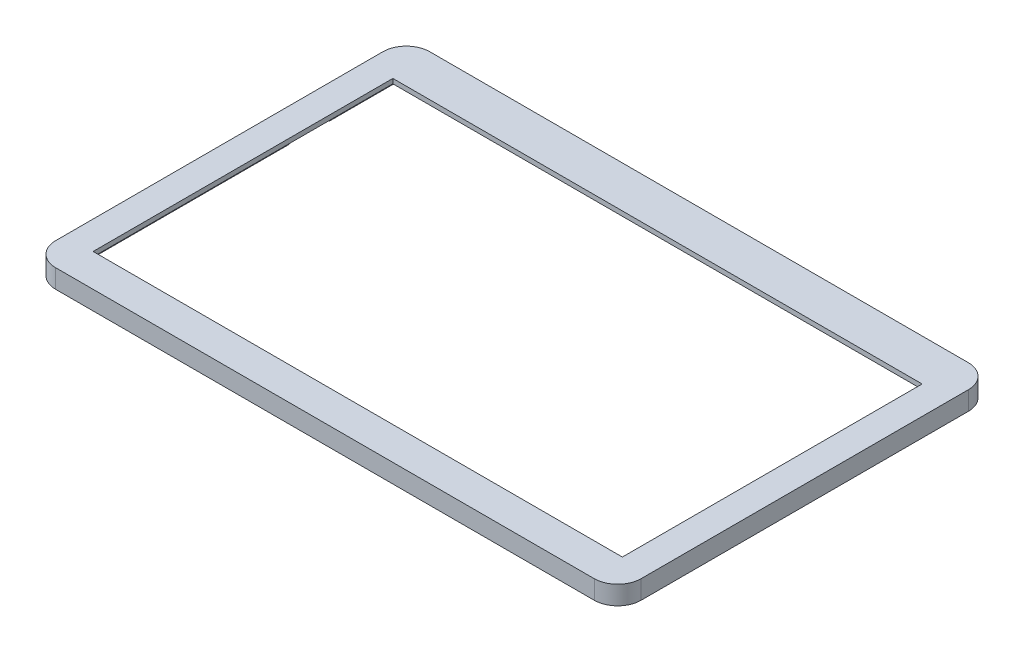
ISO-10303-21;
HEADER;
FILE_DESCRIPTION(('STEP AP214'),'2;1');
FILE_NAME('part.step','',(''),(''),'','','');
FILE_SCHEMA(('AUTOMOTIVE_DESIGN { 1 0 10303 214 1 1 1 1 }'));
ENDSEC;
DATA;
#1=APPLICATION_CONTEXT('core data for automotive mechanical design processes');
#2=APPLICATION_PROTOCOL_DEFINITION('international standard','automotive_design',2000,#1);
#3=PRODUCT_CONTEXT('',#1,'mechanical');
#4=PRODUCT('Part','Part','',(#3));
#5=PRODUCT_RELATED_PRODUCT_CATEGORY('part','',(#4));
#6=PRODUCT_DEFINITION_FORMATION('','',#4);
#7=PRODUCT_DEFINITION_CONTEXT('part definition',#1,'design');
#8=PRODUCT_DEFINITION('design','',#6,#7);
#9=PRODUCT_DEFINITION_SHAPE('','',#8);
#10=(LENGTH_UNIT() NAMED_UNIT(*) SI_UNIT(.MILLI.,.METRE.));
#11=(NAMED_UNIT(*) PLANE_ANGLE_UNIT() SI_UNIT($,.RADIAN.));
#12=(NAMED_UNIT(*) SI_UNIT($,.STERADIAN.) SOLID_ANGLE_UNIT());
#13=UNCERTAINTY_MEASURE_WITH_UNIT(LENGTH_MEASURE(1.E-05),#10,'distance_accuracy_value','');
#14=(GEOMETRIC_REPRESENTATION_CONTEXT(3) GLOBAL_UNCERTAINTY_ASSIGNED_CONTEXT((#13)) GLOBAL_UNIT_ASSIGNED_CONTEXT((#10,
#11,#12)) REPRESENTATION_CONTEXT('',''));
#15=CARTESIAN_POINT('',(0.,0.,0.));
#16=DIRECTION('',(0.,0.,1.));
#17=DIRECTION('',(1.,0.,0.));
#18=AXIS2_PLACEMENT_3D('',#15,#16,#17);
#19=CARTESIAN_POINT('',(0.,8.,0.));
#20=DIRECTION('',(0.,1.,0.));
#21=DIRECTION('',(0.,0.,1.));
#22=AXIS2_PLACEMENT_3D('',#19,#20,#21);
#23=PLANE('',#22);
#24=DIRECTION('',(1.,0.,0.));
#25=VECTOR('',#24,1.);
#26=CARTESIAN_POINT('',(-87.3406720741599,8.,78.8980301274625));
#27=LINE('',#26,#25);
#28=CARTESIAN_POINT('',(-87.3406720741599,8.,78.8980301274625));
#29=VERTEX_POINT('',#28);
#30=CARTESIAN_POINT('',(138.65932792584,8.,78.8980301274625));
#31=VERTEX_POINT('',#30);
#32=EDGE_CURVE('E392',#29,#31,#27,.T.);
#33=ORIENTED_EDGE('',*,*,#32,.F.);
#34=DIRECTION('',(0.,0.,1.));
#35=VECTOR('',#34,1.);
#36=CARTESIAN_POINT('',(-87.3406720741599,8.,-49.1019698725375));
#37=LINE('',#36,#35);
#38=CARTESIAN_POINT('',(-87.3406720741599,8.,-49.1019698725375));
#39=VERTEX_POINT('',#38);
#40=EDGE_CURVE('E389',#39,#29,#37,.T.);
#41=ORIENTED_EDGE('',*,*,#40,.F.);
#42=DIRECTION('',(-1.,0.,0.));
#43=VECTOR('',#42,1.);
#44=CARTESIAN_POINT('',(-87.3406720741599,8.,-49.1019698725375));
#45=LINE('',#44,#43);
#46=CARTESIAN_POINT('',(138.65932792584,8.,-49.1019698725375));
#47=VERTEX_POINT('',#46);
#48=EDGE_CURVE('E399',#47,#39,#45,.T.);
#49=ORIENTED_EDGE('',*,*,#48,.F.);
#50=DIRECTION('',(0.,0.,-1.));
#51=VECTOR('',#50,1.);
#52=CARTESIAN_POINT('',(138.65932792584,8.,-49.1019698725375));
#53=LINE('',#52,#51);
#54=EDGE_CURVE('E395',#31,#47,#53,.T.);
#55=ORIENTED_EDGE('',*,*,#54,.F.);
#56=EDGE_LOOP('',(#33,#41,#49,#55));
#57=FACE_BOUND('',#56,.T.);
#58=CARTESIAN_POINT('',(140.65932792584,8.,82.8980301274625));
#59=DIRECTION('',(0.,1.,0.));
#60=DIRECTION('',(0.,0.,1.));
#61=AXIS2_PLACEMENT_3D('',#58,#59,#60);
#62=CIRCLE('',#61,10.);
#63=CARTESIAN_POINT('',(150.65932792584,8.,82.8980301274624));
#64=VERTEX_POINT('',#63);
#65=CARTESIAN_POINT('',(140.65932792584,8.,92.8980301274625));
#66=VERTEX_POINT('',#65);
#67=EDGE_CURVE('E319',#64,#66,#62,.F.);
#68=ORIENTED_EDGE('',*,*,#67,.F.);
#69=DIRECTION('',(0.,0.,-1.));
#70=VECTOR('',#69,1.);
#71=CARTESIAN_POINT('',(150.65932792584,8.,-63.1019698725375));
#72=LINE('',#71,#70);
#73=CARTESIAN_POINT('',(150.65932792584,8.,-56.8519698725374));
#74=VERTEX_POINT('',#73);
#75=EDGE_CURVE('E428',#64,#74,#72,.T.);
#76=ORIENTED_EDGE('',*,*,#75,.T.);
#77=CARTESIAN_POINT('',(140.65932792584,8.,-56.8519698725375));
#78=DIRECTION('',(0.,1.,0.));
#79=DIRECTION('',(0.,0.,1.));
#80=AXIS2_PLACEMENT_3D('',#77,#78,#79);
#81=CIRCLE('',#80,10.);
#82=CARTESIAN_POINT('',(140.65932792584,8.,-66.8519698725375));
#83=VERTEX_POINT('',#82);
#84=EDGE_CURVE('E316',#83,#74,#81,.F.);
#85=ORIENTED_EDGE('',*,*,#84,.F.);
#86=DIRECTION('',(1.,0.,0.));
#87=VECTOR('',#86,1.);
#88=CARTESIAN_POINT('',(150.65932792584,8.,-66.8519698725375));
#89=LINE('',#88,#87);
#90=CARTESIAN_POINT('',(-89.3406720741599,8.,-66.8519698725375));
#91=VERTEX_POINT('',#90);
#92=EDGE_CURVE('E329',#91,#83,#89,.T.);
#93=ORIENTED_EDGE('',*,*,#92,.F.);
#94=CARTESIAN_POINT('',(-89.3406720741599,8.,-56.8519698725375));
#95=DIRECTION('',(0.,1.,0.));
#96=DIRECTION('',(0.,0.,1.));
#97=AXIS2_PLACEMENT_3D('',#94,#95,#96);
#98=CIRCLE('',#97,9.99999999999999);
#99=CARTESIAN_POINT('',(-99.3406720741599,8.,-56.8519698725374));
#100=VERTEX_POINT('',#99);
#101=EDGE_CURVE('E313',#100,#91,#98,.F.);
#102=ORIENTED_EDGE('',*,*,#101,.F.);
#103=DIRECTION('',(0.,0.,1.));
#104=VECTOR('',#103,1.);
#105=CARTESIAN_POINT('',(-99.3406720741599,8.,-63.1019698725375));
#106=LINE('',#105,#104);
#107=CARTESIAN_POINT('',(-99.3406720741599,8.,82.8980301274624));
#108=VERTEX_POINT('',#107);
#109=EDGE_CURVE('E419',#100,#108,#106,.T.);
#110=ORIENTED_EDGE('',*,*,#109,.T.);
#111=CARTESIAN_POINT('',(-89.3406720741599,8.,82.8980301274625));
#112=DIRECTION('',(0.,1.,0.));
#113=DIRECTION('',(0.,0.,1.));
#114=AXIS2_PLACEMENT_3D('',#111,#112,#113);
#115=CIRCLE('',#114,9.99999999999999);
#116=CARTESIAN_POINT('',(-89.3406720741598,8.,92.8980301274625));
#117=VERTEX_POINT('',#116);
#118=EDGE_CURVE('E322',#117,#108,#115,.F.);
#119=ORIENTED_EDGE('',*,*,#118,.F.);
#120=DIRECTION('',(1.,0.,0.));
#121=VECTOR('',#120,1.);
#122=CARTESIAN_POINT('',(-99.3406720741599,8.,92.8980301274625));
#123=LINE('',#122,#121);
#124=EDGE_CURVE('E423',#117,#66,#123,.T.);
#125=ORIENTED_EDGE('',*,*,#124,.T.);
#126=EDGE_LOOP('',(#68,#76,#85,#93,#102,#110,#119,#125));
#127=FACE_BOUND('',#126,.T.);
#128=ADVANCED_FACE('F38',(#57,#127),#23,.T.);
#129=CARTESIAN_POINT('',(0.,0.,0.));
#130=DIRECTION('',(0.,1.,0.));
#131=DIRECTION('',(0.,0.,1.));
#132=AXIS2_PLACEMENT_3D('',#129,#130,#131);
#133=PLANE('',#132);
#134=CARTESIAN_POINT('',(-86.3406720741599,0.,-61.8519698725375));
#135=DIRECTION('',(0.,-1.,0.));
#136=DIRECTION('',(0.,0.,-1.));
#137=AXIS2_PLACEMENT_3D('',#134,#135,#136);
#138=CIRCLE('',#137,2.);
#139=CARTESIAN_POINT('',(-86.3406720741599,0.,-63.8519698725375));
#140=VERTEX_POINT('',#139);
#141=EDGE_CURVE('E253',#140,#140,#138,.T.);
#142=ORIENTED_EDGE('',*,*,#141,.F.);
#143=EDGE_LOOP('',(#142));
#144=FACE_BOUND('',#143,.T.);
#145=CARTESIAN_POINT('',(137.65932792584,0.,-61.8519698725375));
#146=DIRECTION('',(0.,-1.,0.));
#147=DIRECTION('',(0.,0.,-1.));
#148=AXIS2_PLACEMENT_3D('',#145,#146,#147);
#149=CIRCLE('',#148,2.);
#150=CARTESIAN_POINT('',(137.65932792584,0.,-63.8519698725375));
#151=VERTEX_POINT('',#150);
#152=EDGE_CURVE('E272',#151,#151,#149,.T.);
#153=ORIENTED_EDGE('',*,*,#152,.F.);
#154=EDGE_LOOP('',(#153));
#155=FACE_BOUND('',#154,.T.);
#156=CARTESIAN_POINT('',(137.65932792584,0.,87.8980301274625));
#157=DIRECTION('',(0.,-1.,0.));
#158=DIRECTION('',(0.,0.,-1.));
#159=AXIS2_PLACEMENT_3D('',#156,#157,#158);
#160=CIRCLE('',#159,2.);
#161=CARTESIAN_POINT('',(137.65932792584,0.,85.8980301274625));
#162=VERTEX_POINT('',#161);
#163=EDGE_CURVE('E264',#162,#162,#160,.T.);
#164=ORIENTED_EDGE('',*,*,#163,.F.);
#165=EDGE_LOOP('',(#164));
#166=FACE_BOUND('',#165,.T.);
#167=CARTESIAN_POINT('',(-86.3406720741599,0.,87.8980301274625));
#168=DIRECTION('',(0.,-1.,0.));
#169=DIRECTION('',(0.,0.,-1.));
#170=AXIS2_PLACEMENT_3D('',#167,#168,#169);
#171=CIRCLE('',#170,2.);
#172=CARTESIAN_POINT('',(-86.3406720741599,0.,85.8980301274625));
#173=VERTEX_POINT('',#172);
#174=EDGE_CURVE('E263',#173,#173,#171,.T.);
#175=ORIENTED_EDGE('',*,*,#174,.F.);
#176=EDGE_LOOP('',(#175));
#177=FACE_BOUND('',#176,.T.);
#178=DIRECTION('',(0.,0.,1.));
#179=VECTOR('',#178,1.);
#180=CARTESIAN_POINT('',(-99.3406720741599,0.,-63.1019698725375));
#181=LINE('',#180,#179);
#182=CARTESIAN_POINT('',(-99.3406720741599,0.,-10.5019698725375));
#183=VERTEX_POINT('',#182);
#184=CARTESIAN_POINT('',(-99.3406720741599,0.,82.8980301274624));
#185=VERTEX_POINT('',#184);
#186=EDGE_CURVE('E418',#183,#185,#181,.T.);
#187=ORIENTED_EDGE('',*,*,#186,.F.);
#188=DIRECTION('',(-1.,0.,0.));
#189=VECTOR('',#188,1.);
#190=CARTESIAN_POINT('',(-99.3406720741599,0.,-10.5019698725375));
#191=LINE('',#190,#189);
#192=CARTESIAN_POINT('',(-93.0906720741599,0.,-10.5019698725375));
#193=VERTEX_POINT('',#192);
#194=EDGE_CURVE('E239',#193,#183,#191,.T.);
#195=ORIENTED_EDGE('',*,*,#194,.F.);
#196=DIRECTION('',(0.,0.,-1.));
#197=VECTOR('',#196,1.);
#198=CARTESIAN_POINT('',(-93.0906720741599,0.,82.6480301274625));
#199=LINE('',#198,#197);
#200=CARTESIAN_POINT('',(-93.0906720741599,0.,82.6480301274625));
#201=VERTEX_POINT('',#200);
#202=EDGE_CURVE('E195',#201,#193,#199,.T.);
#203=ORIENTED_EDGE('',*,*,#202,.F.);
#204=DIRECTION('',(-1.,0.,0.));
#205=VECTOR('',#204,1.);
#206=CARTESIAN_POINT('',(-93.0906720741599,0.,82.6480301274625));
#207=LINE('',#206,#205);
#208=CARTESIAN_POINT('',(142.40932792584,0.,82.6480301274625));
#209=VERTEX_POINT('',#208);
#210=EDGE_CURVE('E339',#209,#201,#207,.T.);
#211=ORIENTED_EDGE('',*,*,#210,.F.);
#212=DIRECTION('',(0.,0.,1.));
#213=VECTOR('',#212,1.);
#214=CARTESIAN_POINT('',(142.40932792584,0.,82.6480301274625));
#215=LINE('',#214,#213);
#216=CARTESIAN_POINT('',(142.40932792584,0.,-56.8519698725375));
#217=VERTEX_POINT('',#216);
#218=EDGE_CURVE('E358',#217,#209,#215,.T.);
#219=ORIENTED_EDGE('',*,*,#218,.F.);
#220=DIRECTION('',(1.,0.,0.));
#221=VECTOR('',#220,1.);
#222=CARTESIAN_POINT('',(-93.0906720741599,0.,-56.8519698725375));
#223=LINE('',#222,#221);
#224=CARTESIAN_POINT('',(-93.0906720741599,0.,-56.8519698725375));
#225=VERTEX_POINT('',#224);
#226=EDGE_CURVE('E354',#225,#217,#223,.T.);
#227=ORIENTED_EDGE('',*,*,#226,.F.);
#228=CARTESIAN_POINT('',(-93.0906720741599,0.,-27.7019698725375));
#229=VERTEX_POINT('',#228);
#230=EDGE_CURVE('E333',#229,#225,#199,.T.);
#231=ORIENTED_EDGE('',*,*,#230,.F.);
#232=DIRECTION('',(1.,0.,0.));
#233=VECTOR('',#232,1.);
#234=CARTESIAN_POINT('',(-99.3406720741599,0.,-27.7019698725375));
#235=LINE('',#234,#233);
#236=CARTESIAN_POINT('',(-99.3406720741599,0.,-27.7019698725375));
#237=VERTEX_POINT('',#236);
#238=EDGE_CURVE('E231',#237,#229,#235,.T.);
#239=ORIENTED_EDGE('',*,*,#238,.F.);
#240=CARTESIAN_POINT('',(-99.3406720741599,0.,-56.8519698725374));
#241=VERTEX_POINT('',#240);
#242=EDGE_CURVE('E433',#241,#237,#181,.T.);
#243=ORIENTED_EDGE('',*,*,#242,.F.);
#244=CARTESIAN_POINT('',(-89.3406720741599,0.,-56.8519698725375));
#245=DIRECTION('',(0.,1.,0.));
#246=DIRECTION('',(0.,0.,1.));
#247=AXIS2_PLACEMENT_3D('',#244,#245,#246);
#248=CIRCLE('',#247,9.99999999999999);
#249=CARTESIAN_POINT('',(-89.3406720741598,0.,-66.8519698725375));
#250=VERTEX_POINT('',#249);
#251=EDGE_CURVE('E290',#250,#241,#248,.T.);
#252=ORIENTED_EDGE('',*,*,#251,.F.);
#253=DIRECTION('',(-1.,0.,0.));
#254=VECTOR('',#253,1.);
#255=CARTESIAN_POINT('',(150.65932792584,0.,-66.8519698725375));
#256=LINE('',#255,#254);
#257=CARTESIAN_POINT('',(140.65932792584,0.,-66.8519698725375));
#258=VERTEX_POINT('',#257);
#259=EDGE_CURVE('E325',#258,#250,#256,.T.);
#260=ORIENTED_EDGE('',*,*,#259,.F.);
#261=CARTESIAN_POINT('',(140.65932792584,0.,-56.8519698725375));
#262=DIRECTION('',(0.,1.,0.));
#263=DIRECTION('',(0.,0.,1.));
#264=AXIS2_PLACEMENT_3D('',#261,#262,#263);
#265=CIRCLE('',#264,10.);
#266=CARTESIAN_POINT('',(150.65932792584,0.,-56.8519698725374));
#267=VERTEX_POINT('',#266);
#268=EDGE_CURVE('E298',#267,#258,#265,.T.);
#269=ORIENTED_EDGE('',*,*,#268,.F.);
#270=DIRECTION('',(0.,0.,-1.));
#271=VECTOR('',#270,1.);
#272=CARTESIAN_POINT('',(150.65932792584,0.,-63.1019698725375));
#273=LINE('',#272,#271);
#274=CARTESIAN_POINT('',(150.65932792584,0.,82.8980301274624));
#275=VERTEX_POINT('',#274);
#276=EDGE_CURVE('E424',#275,#267,#273,.T.);
#277=ORIENTED_EDGE('',*,*,#276,.F.);
#278=CARTESIAN_POINT('',(140.65932792584,0.,82.8980301274625));
#279=DIRECTION('',(0.,1.,0.));
#280=DIRECTION('',(0.,0.,1.));
#281=AXIS2_PLACEMENT_3D('',#278,#279,#280);
#282=CIRCLE('',#281,10.);
#283=CARTESIAN_POINT('',(140.65932792584,0.,92.8980301274625));
#284=VERTEX_POINT('',#283);
#285=EDGE_CURVE('E61',#284,#275,#282,.T.);
#286=ORIENTED_EDGE('',*,*,#285,.F.);
#287=DIRECTION('',(1.,0.,0.));
#288=VECTOR('',#287,1.);
#289=CARTESIAN_POINT('',(-99.3406720741599,0.,92.8980301274625));
#290=LINE('',#289,#288);
#291=CARTESIAN_POINT('',(-89.3406720741598,0.,92.8980301274625));
#292=VERTEX_POINT('',#291);
#293=EDGE_CURVE('E437',#292,#284,#290,.T.);
#294=ORIENTED_EDGE('',*,*,#293,.F.);
#295=CARTESIAN_POINT('',(-89.3406720741599,0.,82.8980301274625));
#296=DIRECTION('',(0.,1.,0.));
#297=DIRECTION('',(0.,0.,1.));
#298=AXIS2_PLACEMENT_3D('',#295,#296,#297);
#299=CIRCLE('',#298,9.99999999999999);
#300=EDGE_CURVE('E53',#185,#292,#299,.T.);
#301=ORIENTED_EDGE('',*,*,#300,.F.);
#302=EDGE_LOOP('',(#187,#195,#203,#211,#219,#227,#231,#239,#243,#252,#260,#269,#277,#286,#294,#301));
#303=FACE_BOUND('',#302,.T.);
#304=ADVANCED_FACE('F473',(#144,#155,#166,#177,#303),#133,.F.);
#305=CARTESIAN_POINT('',(-99.3406720741599,8.,-63.1019698725375));
#306=DIRECTION('',(1.,0.,0.));
#307=DIRECTION('',(0.,0.,-1.));
#308=AXIS2_PLACEMENT_3D('',#305,#306,#307);
#309=PLANE('',#308);
#310=DIRECTION('',(0.,0.,-1.));
#311=VECTOR('',#310,1.);
#312=CARTESIAN_POINT('',(-99.3406720741599,1.5,-10.5019698725375));
#313=LINE('',#312,#311);
#314=CARTESIAN_POINT('',(-99.3406720741599,1.5,-10.5019698725375));
#315=VERTEX_POINT('',#314);
#316=CARTESIAN_POINT('',(-99.3406720741599,1.5,-27.7019698725375));
#317=VERTEX_POINT('',#316);
#318=EDGE_CURVE('E234',#315,#317,#313,.T.);
#319=ORIENTED_EDGE('',*,*,#318,.F.);
#320=DIRECTION('',(0.,-1.,0.));
#321=VECTOR('',#320,1.);
#322=CARTESIAN_POINT('',(-99.3406720741599,1.5,-10.5019698725375));
#323=LINE('',#322,#321);
#324=EDGE_CURVE('E199',#315,#183,#323,.T.);
#325=ORIENTED_EDGE('',*,*,#324,.T.);
#326=ORIENTED_EDGE('',*,*,#186,.T.);
#327=DIRECTION('',(0.,-1.,0.));
#328=VECTOR('',#327,1.);
#329=CARTESIAN_POINT('',(-99.3406720741599,10.,82.8980301274624));
#330=LINE('',#329,#328);
#331=EDGE_CURVE('E310',#108,#185,#330,.T.);
#332=ORIENTED_EDGE('',*,*,#331,.F.);
#333=ORIENTED_EDGE('',*,*,#109,.F.);
#334=DIRECTION('',(0.,-1.,0.));
#335=VECTOR('',#334,1.);
#336=CARTESIAN_POINT('',(-99.3406720741599,10.,-56.8519698725374));
#337=LINE('',#336,#335);
#338=EDGE_CURVE('E293',#100,#241,#337,.T.);
#339=ORIENTED_EDGE('',*,*,#338,.T.);
#340=ORIENTED_EDGE('',*,*,#242,.T.);
#341=DIRECTION('',(0.,-1.,0.));
#342=VECTOR('',#341,1.);
#343=CARTESIAN_POINT('',(-99.3406720741599,1.5,-27.7019698725375));
#344=LINE('',#343,#342);
#345=EDGE_CURVE('E246',#317,#237,#344,.T.);
#346=ORIENTED_EDGE('',*,*,#345,.F.);
#347=EDGE_LOOP('',(#319,#325,#326,#332,#333,#339,#340,#346));
#348=FACE_BOUND('',#347,.T.);
#349=ADVANCED_FACE('F40',(#348),#309,.F.);
#350=CARTESIAN_POINT('',(-99.3406720741599,8.,92.8980301274625));
#351=DIRECTION('',(0.,0.,-1.));
#352=DIRECTION('',(-1.,0.,0.));
#353=AXIS2_PLACEMENT_3D('',#350,#351,#352);
#354=PLANE('',#353);
#355=ORIENTED_EDGE('',*,*,#293,.T.);
#356=DIRECTION('',(0.,-1.,0.));
#357=VECTOR('',#356,1.);
#358=CARTESIAN_POINT('',(140.65932792584,10.,92.8980301274625));
#359=LINE('',#358,#357);
#360=EDGE_CURVE('E301',#66,#284,#359,.T.);
#361=ORIENTED_EDGE('',*,*,#360,.F.);
#362=ORIENTED_EDGE('',*,*,#124,.F.);
#363=DIRECTION('',(0.,-1.,0.));
#364=VECTOR('',#363,1.);
#365=CARTESIAN_POINT('',(-89.3406720741599,10.,92.8980301274625));
#366=LINE('',#365,#364);
#367=EDGE_CURVE('E11',#292,#117,#366,.F.);
#368=ORIENTED_EDGE('',*,*,#367,.F.);
#369=EDGE_LOOP('',(#355,#361,#362,#368));
#370=FACE_BOUND('',#369,.T.);
#371=ADVANCED_FACE('F488',(#370),#354,.F.);
#372=CARTESIAN_POINT('',(150.65932792584,8.,-63.1019698725375));
#373=DIRECTION('',(-1.,0.,0.));
#374=DIRECTION('',(0.,0.,1.));
#375=AXIS2_PLACEMENT_3D('',#372,#373,#374);
#376=PLANE('',#375);
#377=DIRECTION('',(0.,-1.,0.));
#378=VECTOR('',#377,1.);
#379=CARTESIAN_POINT('',(150.65932792584,10.,82.8980301274625));
#380=LINE('',#379,#378);
#381=EDGE_CURVE('E47',#275,#64,#380,.F.);
#382=ORIENTED_EDGE('',*,*,#381,.F.);
#383=ORIENTED_EDGE('',*,*,#276,.T.);
#384=DIRECTION('',(0.,-1.,0.));
#385=VECTOR('',#384,1.);
#386=CARTESIAN_POINT('',(150.65932792584,10.,-56.8519698725374));
#387=LINE('',#386,#385);
#388=EDGE_CURVE('E294',#74,#267,#387,.T.);
#389=ORIENTED_EDGE('',*,*,#388,.F.);
#390=ORIENTED_EDGE('',*,*,#75,.F.);
#391=EDGE_LOOP('',(#382,#383,#389,#390));
#392=FACE_BOUND('',#391,.T.);
#393=ADVANCED_FACE('F465',(#392),#376,.F.);
#394=CARTESIAN_POINT('',(0.,0.,-66.8519698725375));
#395=DIRECTION('',(0.,0.,-1.));
#396=DIRECTION('',(-1.,0.,0.));
#397=AXIS2_PLACEMENT_3D('',#394,#395,#396);
#398=PLANE('',#397);
#399=DIRECTION('',(0.,-1.,0.));
#400=VECTOR('',#399,1.);
#401=CARTESIAN_POINT('',(140.65932792584,10.,-66.8519698725375));
#402=LINE('',#401,#400);
#403=EDGE_CURVE('E451',#258,#83,#402,.F.);
#404=ORIENTED_EDGE('',*,*,#403,.F.);
#405=ORIENTED_EDGE('',*,*,#259,.T.);
#406=DIRECTION('',(0.,-1.,0.));
#407=VECTOR('',#406,1.);
#408=CARTESIAN_POINT('',(-89.3406720741599,10.,-66.8519698725375));
#409=LINE('',#408,#407);
#410=EDGE_CURVE('E447',#250,#91,#409,.F.);
#411=ORIENTED_EDGE('',*,*,#410,.T.);
#412=ORIENTED_EDGE('',*,*,#92,.T.);
#413=EDGE_LOOP('',(#404,#405,#411,#412));
#414=FACE_BOUND('',#413,.T.);
#415=ADVANCED_FACE('F477',(#414),#398,.T.);
#416=CARTESIAN_POINT('',(-87.3406720741599,8.,-49.1019698725375));
#417=DIRECTION('',(1.,0.,0.));
#418=DIRECTION('',(0.,0.,-1.));
#419=AXIS2_PLACEMENT_3D('',#416,#417,#418);
#420=PLANE('',#419);
#421=DIRECTION('',(0.,-1.,0.));
#422=VECTOR('',#421,1.);
#423=CARTESIAN_POINT('',(-87.3406720741599,8.,78.8980301274625));
#424=LINE('',#423,#422);
#425=CARTESIAN_POINT('',(-87.3406720741599,6.,78.8980301274625));
#426=VERTEX_POINT('',#425);
#427=EDGE_CURVE('E414',#29,#426,#424,.T.);
#428=ORIENTED_EDGE('',*,*,#427,.T.);
#429=DIRECTION('',(0.,0.,-1.));
#430=VECTOR('',#429,1.);
#431=CARTESIAN_POINT('',(-87.3406720741599,6.,-49.1019698725375));
#432=LINE('',#431,#430);
#433=CARTESIAN_POINT('',(-87.3406720741599,6.,-49.1019698725375));
#434=VERTEX_POINT('',#433);
#435=EDGE_CURVE('E385',#426,#434,#432,.T.);
#436=ORIENTED_EDGE('',*,*,#435,.T.);
#437=DIRECTION('',(0.,-1.,0.));
#438=VECTOR('',#437,1.);
#439=CARTESIAN_POINT('',(-87.3406720741599,8.,-49.1019698725375));
#440=LINE('',#439,#438);
#441=EDGE_CURVE('E402',#39,#434,#440,.T.);
#442=ORIENTED_EDGE('',*,*,#441,.F.);
#443=ORIENTED_EDGE('',*,*,#40,.T.);
#444=EDGE_LOOP('',(#428,#436,#442,#443));
#445=FACE_BOUND('',#444,.T.);
#446=ADVANCED_FACE('F507',(#445),#420,.T.);
#447=CARTESIAN_POINT('',(-87.3406720741599,8.,78.8980301274625));
#448=DIRECTION('',(0.,0.,-1.));
#449=DIRECTION('',(-1.,0.,0.));
#450=AXIS2_PLACEMENT_3D('',#447,#448,#449);
#451=PLANE('',#450);
#452=DIRECTION('',(0.,-1.,0.));
#453=VECTOR('',#452,1.);
#454=CARTESIAN_POINT('',(138.65932792584,8.,78.8980301274625));
#455=LINE('',#454,#453);
#456=CARTESIAN_POINT('',(138.65932792584,6.,78.8980301274625));
#457=VERTEX_POINT('',#456);
#458=EDGE_CURVE('E410',#31,#457,#455,.T.);
#459=ORIENTED_EDGE('',*,*,#458,.T.);
#460=DIRECTION('',(-1.,0.,0.));
#461=VECTOR('',#460,1.);
#462=CARTESIAN_POINT('',(-87.3406720741599,6.,78.8980301274625));
#463=LINE('',#462,#461);
#464=EDGE_CURVE('E381',#457,#426,#463,.T.);
#465=ORIENTED_EDGE('',*,*,#464,.T.);
#466=ORIENTED_EDGE('',*,*,#427,.F.);
#467=ORIENTED_EDGE('',*,*,#32,.T.);
#468=EDGE_LOOP('',(#459,#465,#466,#467));
#469=FACE_BOUND('',#468,.T.);
#470=ADVANCED_FACE('F510',(#469),#451,.T.);
#471=CARTESIAN_POINT('',(138.65932792584,8.,-49.1019698725375));
#472=DIRECTION('',(-1.,0.,0.));
#473=DIRECTION('',(0.,0.,1.));
#474=AXIS2_PLACEMENT_3D('',#471,#472,#473);
#475=PLANE('',#474);
#476=DIRECTION('',(0.,-1.,0.));
#477=VECTOR('',#476,1.);
#478=CARTESIAN_POINT('',(138.65932792584,8.,-49.1019698725375));
#479=LINE('',#478,#477);
#480=CARTESIAN_POINT('',(138.65932792584,6.,-49.1019698725375));
#481=VERTEX_POINT('',#480);
#482=EDGE_CURVE('E406',#47,#481,#479,.T.);
#483=ORIENTED_EDGE('',*,*,#482,.T.);
#484=DIRECTION('',(0.,0.,1.));
#485=VECTOR('',#484,1.);
#486=CARTESIAN_POINT('',(138.65932792584,6.,-49.1019698725375));
#487=LINE('',#486,#485);
#488=EDGE_CURVE('E368',#481,#457,#487,.T.);
#489=ORIENTED_EDGE('',*,*,#488,.T.);
#490=ORIENTED_EDGE('',*,*,#458,.F.);
#491=ORIENTED_EDGE('',*,*,#54,.T.);
#492=EDGE_LOOP('',(#483,#489,#490,#491));
#493=FACE_BOUND('',#492,.T.);
#494=ADVANCED_FACE('F514',(#493),#475,.T.);
#495=CARTESIAN_POINT('',(-87.3406720741599,8.,-49.1019698725375));
#496=DIRECTION('',(0.,0.,1.));
#497=DIRECTION('',(1.,0.,0.));
#498=AXIS2_PLACEMENT_3D('',#495,#496,#497);
#499=PLANE('',#498);
#500=ORIENTED_EDGE('',*,*,#441,.T.);
#501=DIRECTION('',(1.,0.,0.));
#502=VECTOR('',#501,1.);
#503=CARTESIAN_POINT('',(-87.3406720741599,6.,-49.1019698725375));
#504=LINE('',#503,#502);
#505=EDGE_CURVE('E432',#434,#481,#504,.T.);
#506=ORIENTED_EDGE('',*,*,#505,.T.);
#507=ORIENTED_EDGE('',*,*,#482,.F.);
#508=ORIENTED_EDGE('',*,*,#48,.T.);
#509=EDGE_LOOP('',(#500,#506,#507,#508));
#510=FACE_BOUND('',#509,.T.);
#511=ADVANCED_FACE('F518',(#510),#499,.T.);
#512=CARTESIAN_POINT('',(-93.0906720741599,6.,82.6480301274625));
#513=DIRECTION('',(-1.,0.,0.));
#514=DIRECTION('',(0.,0.,1.));
#515=AXIS2_PLACEMENT_3D('',#512,#513,#514);
#516=PLANE('',#515);
#517=DIRECTION('',(0.,0.,1.));
#518=VECTOR('',#517,1.);
#519=CARTESIAN_POINT('',(-93.0906720741599,3.,-27.7019698725375));
#520=LINE('',#519,#518);
#521=CARTESIAN_POINT('',(-93.0906720741599,3.,-27.7019698725375));
#522=VERTEX_POINT('',#521);
#523=CARTESIAN_POINT('',(-93.0906720741599,3.,-10.5019698725375));
#524=VERTEX_POINT('',#523);
#525=EDGE_CURVE('E193',#522,#524,#520,.T.);
#526=ORIENTED_EDGE('',*,*,#525,.F.);
#527=DIRECTION('',(0.,-1.,0.));
#528=VECTOR('',#527,1.);
#529=CARTESIAN_POINT('',(-93.0906720741599,1.5,-27.7019698725375));
#530=LINE('',#529,#528);
#531=EDGE_CURVE('E200',#522,#229,#530,.T.);
#532=ORIENTED_EDGE('',*,*,#531,.T.);
#533=ORIENTED_EDGE('',*,*,#230,.T.);
#534=DIRECTION('',(0.,-1.,0.));
#535=VECTOR('',#534,1.);
#536=CARTESIAN_POINT('',(-93.0906720741599,6.,-56.8519698725375));
#537=LINE('',#536,#535);
#538=CARTESIAN_POINT('',(-93.0906720741599,6.,-56.8519698725375));
#539=VERTEX_POINT('',#538);
#540=EDGE_CURVE('E351',#539,#225,#537,.T.);
#541=ORIENTED_EDGE('',*,*,#540,.F.);
#542=DIRECTION('',(0.,0.,-1.));
#543=VECTOR('',#542,1.);
#544=CARTESIAN_POINT('',(-93.0906720741599,6.,82.6480301274625));
#545=LINE('',#544,#543);
#546=CARTESIAN_POINT('',(-93.0906720741599,6.,82.6480301274625));
#547=VERTEX_POINT('',#546);
#548=EDGE_CURVE('E334',#547,#539,#545,.T.);
#549=ORIENTED_EDGE('',*,*,#548,.F.);
#550=DIRECTION('',(0.,-1.,0.));
#551=VECTOR('',#550,1.);
#552=CARTESIAN_POINT('',(-93.0906720741599,6.,82.6480301274625));
#553=LINE('',#552,#551);
#554=EDGE_CURVE('E365',#547,#201,#553,.T.);
#555=ORIENTED_EDGE('',*,*,#554,.T.);
#556=ORIENTED_EDGE('',*,*,#202,.T.);
#557=DIRECTION('',(0.,-1.,0.));
#558=VECTOR('',#557,1.);
#559=CARTESIAN_POINT('',(-93.0906720741599,1.5,-10.5019698725375));
#560=LINE('',#559,#558);
#561=EDGE_CURVE('E188',#524,#193,#560,.T.);
#562=ORIENTED_EDGE('',*,*,#561,.F.);
#563=EDGE_LOOP('',(#526,#532,#533,#541,#549,#555,#556,#562));
#564=FACE_BOUND('',#563,.T.);
#565=ADVANCED_FACE('F190',(#564),#516,.F.);
#566=CARTESIAN_POINT('',(-93.0906720741599,6.,82.6480301274625));
#567=DIRECTION('',(0.,0.,1.));
#568=DIRECTION('',(1.,0.,0.));
#569=AXIS2_PLACEMENT_3D('',#566,#567,#568);
#570=PLANE('',#569);
#571=ORIENTED_EDGE('',*,*,#210,.T.);
#572=ORIENTED_EDGE('',*,*,#554,.F.);
#573=DIRECTION('',(-1.,0.,0.));
#574=VECTOR('',#573,1.);
#575=CARTESIAN_POINT('',(-93.0906720741599,6.,82.6480301274625));
#576=LINE('',#575,#574);
#577=CARTESIAN_POINT('',(142.40932792584,6.,82.6480301274625));
#578=VERTEX_POINT('',#577);
#579=EDGE_CURVE('E347',#578,#547,#576,.T.);
#580=ORIENTED_EDGE('',*,*,#579,.F.);
#581=DIRECTION('',(0.,-1.,0.));
#582=VECTOR('',#581,1.);
#583=CARTESIAN_POINT('',(142.40932792584,6.,82.6480301274625));
#584=LINE('',#583,#582);
#585=EDGE_CURVE('E369',#578,#209,#584,.T.);
#586=ORIENTED_EDGE('',*,*,#585,.T.);
#587=EDGE_LOOP('',(#571,#572,#580,#586));
#588=FACE_BOUND('',#587,.T.);
#589=ADVANCED_FACE('F525',(#588),#570,.F.);
#590=CARTESIAN_POINT('',(142.40932792584,6.,82.6480301274625));
#591=DIRECTION('',(1.,0.,0.));
#592=DIRECTION('',(0.,0.,-1.));
#593=AXIS2_PLACEMENT_3D('',#590,#591,#592);
#594=PLANE('',#593);
#595=ORIENTED_EDGE('',*,*,#218,.T.);
#596=ORIENTED_EDGE('',*,*,#585,.F.);
#597=DIRECTION('',(0.,0.,1.));
#598=VECTOR('',#597,1.);
#599=CARTESIAN_POINT('',(142.40932792584,6.,82.6480301274625));
#600=LINE('',#599,#598);
#601=CARTESIAN_POINT('',(142.40932792584,6.,-56.8519698725375));
#602=VERTEX_POINT('',#601);
#603=EDGE_CURVE('E343',#602,#578,#600,.T.);
#604=ORIENTED_EDGE('',*,*,#603,.F.);
#605=DIRECTION('',(0.,-1.,0.));
#606=VECTOR('',#605,1.);
#607=CARTESIAN_POINT('',(142.40932792584,6.,-56.8519698725375));
#608=LINE('',#607,#606);
#609=EDGE_CURVE('E372',#602,#217,#608,.T.);
#610=ORIENTED_EDGE('',*,*,#609,.T.);
#611=EDGE_LOOP('',(#595,#596,#604,#610));
#612=FACE_BOUND('',#611,.T.);
#613=ADVANCED_FACE('F530',(#612),#594,.F.);
#614=CARTESIAN_POINT('',(-93.0906720741599,6.,-56.8519698725375));
#615=DIRECTION('',(0.,0.,-1.));
#616=DIRECTION('',(-1.,0.,0.));
#617=AXIS2_PLACEMENT_3D('',#614,#615,#616);
#618=PLANE('',#617);
#619=ORIENTED_EDGE('',*,*,#226,.T.);
#620=ORIENTED_EDGE('',*,*,#609,.F.);
#621=DIRECTION('',(1.,0.,0.));
#622=VECTOR('',#621,1.);
#623=CARTESIAN_POINT('',(-93.0906720741599,6.,-56.8519698725375));
#624=LINE('',#623,#622);
#625=EDGE_CURVE('E338',#539,#602,#624,.T.);
#626=ORIENTED_EDGE('',*,*,#625,.F.);
#627=ORIENTED_EDGE('',*,*,#540,.T.);
#628=EDGE_LOOP('',(#619,#620,#626,#627));
#629=FACE_BOUND('',#628,.T.);
#630=ADVANCED_FACE('F526',(#629),#618,.F.);
#631=CARTESIAN_POINT('',(0.,6.,0.));
#632=DIRECTION('',(0.,-1.,0.));
#633=DIRECTION('',(0.,0.,-1.));
#634=AXIS2_PLACEMENT_3D('',#631,#632,#633);
#635=PLANE('',#634);
#636=ORIENTED_EDGE('',*,*,#464,.F.);
#637=ORIENTED_EDGE('',*,*,#488,.F.);
#638=ORIENTED_EDGE('',*,*,#505,.F.);
#639=ORIENTED_EDGE('',*,*,#435,.F.);
#640=EDGE_LOOP('',(#636,#637,#638,#639));
#641=FACE_BOUND('',#640,.T.);
#642=ORIENTED_EDGE('',*,*,#548,.T.);
#643=ORIENTED_EDGE('',*,*,#625,.T.);
#644=ORIENTED_EDGE('',*,*,#603,.T.);
#645=ORIENTED_EDGE('',*,*,#579,.T.);
#646=EDGE_LOOP('',(#642,#643,#644,#645));
#647=FACE_BOUND('',#646,.T.);
#648=ADVANCED_FACE('F529',(#641,#647),#635,.T.);
#649=CARTESIAN_POINT('',(-89.3406720741599,10.,-56.8519698725375));
#650=DIRECTION('',(0.,-1.,0.));
#651=DIRECTION('',(0.,0.,-1.));
#652=AXIS2_PLACEMENT_3D('',#649,#650,#651);
#653=CYLINDRICAL_SURFACE('',#652,9.99999999999999);
#654=ORIENTED_EDGE('',*,*,#101,.T.);
#655=ORIENTED_EDGE('',*,*,#410,.F.);
#656=ORIENTED_EDGE('',*,*,#251,.T.);
#657=ORIENTED_EDGE('',*,*,#338,.F.);
#658=EDGE_LOOP('',(#654,#655,#656,#657));
#659=FACE_BOUND('',#658,.T.);
#660=ADVANCED_FACE('F540',(#659),#653,.T.);
#661=CARTESIAN_POINT('',(140.65932792584,10.,-56.8519698725375));
#662=DIRECTION('',(0.,-1.,0.));
#663=DIRECTION('',(0.,0.,-1.));
#664=AXIS2_PLACEMENT_3D('',#661,#662,#663);
#665=CYLINDRICAL_SURFACE('',#664,10.);
#666=ORIENTED_EDGE('',*,*,#84,.T.);
#667=ORIENTED_EDGE('',*,*,#388,.T.);
#668=ORIENTED_EDGE('',*,*,#268,.T.);
#669=ORIENTED_EDGE('',*,*,#403,.T.);
#670=EDGE_LOOP('',(#666,#667,#668,#669));
#671=FACE_BOUND('',#670,.T.);
#672=ADVANCED_FACE('F468',(#671),#665,.T.);
#673=CARTESIAN_POINT('',(140.65932792584,10.,82.8980301274625));
#674=DIRECTION('',(0.,-1.,0.));
#675=DIRECTION('',(0.,0.,-1.));
#676=AXIS2_PLACEMENT_3D('',#673,#674,#675);
#677=CYLINDRICAL_SURFACE('',#676,10.);
#678=ORIENTED_EDGE('',*,*,#67,.T.);
#679=ORIENTED_EDGE('',*,*,#360,.T.);
#680=ORIENTED_EDGE('',*,*,#285,.T.);
#681=ORIENTED_EDGE('',*,*,#381,.T.);
#682=EDGE_LOOP('',(#678,#679,#680,#681));
#683=FACE_BOUND('',#682,.T.);
#684=ADVANCED_FACE('F455',(#683),#677,.T.);
#685=CARTESIAN_POINT('',(-89.3406720741599,10.,82.8980301274625));
#686=DIRECTION('',(0.,-1.,0.));
#687=DIRECTION('',(0.,0.,-1.));
#688=AXIS2_PLACEMENT_3D('',#685,#686,#687);
#689=CYLINDRICAL_SURFACE('',#688,9.99999999999999);
#690=ORIENTED_EDGE('',*,*,#118,.T.);
#691=ORIENTED_EDGE('',*,*,#331,.T.);
#692=ORIENTED_EDGE('',*,*,#300,.T.);
#693=ORIENTED_EDGE('',*,*,#367,.T.);
#694=EDGE_LOOP('',(#690,#691,#692,#693));
#695=FACE_BOUND('',#694,.T.);
#696=ADVANCED_FACE('F485',(#695),#689,.T.);
#697=CARTESIAN_POINT('',(-86.3406720741599,6.,87.8980301274625));
#698=DIRECTION('',(0.,-1.,0.));
#699=DIRECTION('',(0.,0.,-1.));
#700=AXIS2_PLACEMENT_3D('',#697,#698,#699);
#701=CYLINDRICAL_SURFACE('',#700,2.);
#702=CARTESIAN_POINT('',(-86.3406720741599,6.,87.8980301274625));
#703=DIRECTION('',(0.,-1.,0.));
#704=DIRECTION('',(0.,0.,-1.));
#705=AXIS2_PLACEMENT_3D('',#702,#703,#704);
#706=CIRCLE('',#705,2.);
#707=CARTESIAN_POINT('',(-86.3406720741599,6.,85.8980301274625));
#708=VERTEX_POINT('',#707);
#709=EDGE_CURVE('E283',#708,#708,#706,.T.);
#710=ORIENTED_EDGE('',*,*,#709,.F.);
#711=EDGE_LOOP('',(#710));
#712=FACE_BOUND('',#711,.T.);
#713=ORIENTED_EDGE('',*,*,#174,.T.);
#714=EDGE_LOOP('',(#713));
#715=FACE_BOUND('',#714,.T.);
#716=ADVANCED_FACE('F546',(#712,#715),#701,.F.);
#717=CARTESIAN_POINT('',(-86.3406720741599,6.,87.8980301274625));
#718=DIRECTION('',(0.,-1.,0.));
#719=DIRECTION('',(0.,0.,-1.));
#720=AXIS2_PLACEMENT_3D('',#717,#718,#719);
#721=PLANE('',#720);
#722=ORIENTED_EDGE('',*,*,#709,.T.);
#723=EDGE_LOOP('',(#722));
#724=FACE_BOUND('',#723,.T.);
#725=ADVANCED_FACE('F555',(#724),#721,.T.);
#726=CARTESIAN_POINT('',(137.65932792584,6.,87.8980301274625));
#727=DIRECTION('',(0.,-1.,0.));
#728=DIRECTION('',(0.,0.,-1.));
#729=AXIS2_PLACEMENT_3D('',#726,#727,#728);
#730=CYLINDRICAL_SURFACE('',#729,2.);
#731=CARTESIAN_POINT('',(137.65932792584,6.,87.8980301274625));
#732=DIRECTION('',(0.,-1.,0.));
#733=DIRECTION('',(0.,0.,-1.));
#734=AXIS2_PLACEMENT_3D('',#731,#732,#733);
#735=CIRCLE('',#734,2.);
#736=CARTESIAN_POINT('',(137.65932792584,6.,85.8980301274625));
#737=VERTEX_POINT('',#736);
#738=EDGE_CURVE('E259',#737,#737,#735,.T.);
#739=ORIENTED_EDGE('',*,*,#738,.F.);
#740=EDGE_LOOP('',(#739));
#741=FACE_BOUND('',#740,.T.);
#742=ORIENTED_EDGE('',*,*,#163,.T.);
#743=EDGE_LOOP('',(#742));
#744=FACE_BOUND('',#743,.T.);
#745=ADVANCED_FACE('F559',(#741,#744),#730,.F.);
#746=CARTESIAN_POINT('',(137.65932792584,6.,87.8980301274625));
#747=DIRECTION('',(0.,-1.,0.));
#748=DIRECTION('',(0.,0.,-1.));
#749=AXIS2_PLACEMENT_3D('',#746,#747,#748);
#750=PLANE('',#749);
#751=ORIENTED_EDGE('',*,*,#738,.T.);
#752=EDGE_LOOP('',(#751));
#753=FACE_BOUND('',#752,.T.);
#754=ADVANCED_FACE('F573',(#753),#750,.T.);
#755=CARTESIAN_POINT('',(137.65932792584,6.,-61.8519698725375));
#756=DIRECTION('',(0.,-1.,0.));
#757=DIRECTION('',(0.,0.,-1.));
#758=AXIS2_PLACEMENT_3D('',#755,#756,#757);
#759=CYLINDRICAL_SURFACE('',#758,2.);
#760=CARTESIAN_POINT('',(137.65932792584,6.,-61.8519698725375));
#761=DIRECTION('',(0.,-1.,0.));
#762=DIRECTION('',(0.,0.,-1.));
#763=AXIS2_PLACEMENT_3D('',#760,#761,#762);
#764=CIRCLE('',#763,2.);
#765=CARTESIAN_POINT('',(137.65932792584,6.,-63.8519698725375));
#766=VERTEX_POINT('',#765);
#767=EDGE_CURVE('E268',#766,#766,#764,.T.);
#768=ORIENTED_EDGE('',*,*,#767,.F.);
#769=EDGE_LOOP('',(#768));
#770=FACE_BOUND('',#769,.T.);
#771=ORIENTED_EDGE('',*,*,#152,.T.);
#772=EDGE_LOOP('',(#771));
#773=FACE_BOUND('',#772,.T.);
#774=ADVANCED_FACE('F570',(#770,#773),#759,.F.);
#775=CARTESIAN_POINT('',(137.65932792584,6.,-61.8519698725375));
#776=DIRECTION('',(0.,-1.,0.));
#777=DIRECTION('',(0.,0.,-1.));
#778=AXIS2_PLACEMENT_3D('',#775,#776,#777);
#779=PLANE('',#778);
#780=ORIENTED_EDGE('',*,*,#767,.T.);
#781=EDGE_LOOP('',(#780));
#782=FACE_BOUND('',#781,.T.);
#783=ADVANCED_FACE('F565',(#782),#779,.T.);
#784=CARTESIAN_POINT('',(-86.3406720741599,6.,-61.8519698725375));
#785=DIRECTION('',(0.,-1.,0.));
#786=DIRECTION('',(0.,0.,-1.));
#787=AXIS2_PLACEMENT_3D('',#784,#785,#786);
#788=CYLINDRICAL_SURFACE('',#787,2.);
#789=CARTESIAN_POINT('',(-86.3406720741599,6.,-61.8519698725375));
#790=DIRECTION('',(0.,-1.,0.));
#791=DIRECTION('',(0.,0.,-1.));
#792=AXIS2_PLACEMENT_3D('',#789,#790,#791);
#793=CIRCLE('',#792,2.);
#794=CARTESIAN_POINT('',(-86.3406720741599,6.,-63.8519698725375));
#795=VERTEX_POINT('',#794);
#796=EDGE_CURVE('E276',#795,#795,#793,.T.);
#797=ORIENTED_EDGE('',*,*,#796,.F.);
#798=EDGE_LOOP('',(#797));
#799=FACE_BOUND('',#798,.T.);
#800=ORIENTED_EDGE('',*,*,#141,.T.);
#801=EDGE_LOOP('',(#800));
#802=FACE_BOUND('',#801,.T.);
#803=ADVANCED_FACE('F561',(#799,#802),#788,.F.);
#804=CARTESIAN_POINT('',(-86.3406720741599,6.,-61.8519698725375));
#805=DIRECTION('',(0.,-1.,0.));
#806=DIRECTION('',(0.,0.,-1.));
#807=AXIS2_PLACEMENT_3D('',#804,#805,#806);
#808=PLANE('',#807);
#809=ORIENTED_EDGE('',*,*,#796,.T.);
#810=EDGE_LOOP('',(#809));
#811=FACE_BOUND('',#810,.T.);
#812=ADVANCED_FACE('F564',(#811),#808,.T.);
#813=CARTESIAN_POINT('',(-99.3406720741599,1.5,-10.5019698725375));
#814=DIRECTION('',(0.,0.,1.));
#815=DIRECTION('',(1.,0.,0.));
#816=AXIS2_PLACEMENT_3D('',#813,#814,#815);
#817=PLANE('',#816);
#818=ORIENTED_EDGE('',*,*,#194,.T.);
#819=ORIENTED_EDGE('',*,*,#324,.F.);
#820=DIRECTION('',(-1.,0.,0.));
#821=VECTOR('',#820,1.);
#822=CARTESIAN_POINT('',(-99.3406720741599,1.5,-10.5019698725375));
#823=LINE('',#822,#821);
#824=CARTESIAN_POINT('',(-96.9406720741599,1.5,-10.5019698725375));
#825=VERTEX_POINT('',#824);
#826=EDGE_CURVE('E243',#825,#315,#823,.T.);
#827=ORIENTED_EDGE('',*,*,#826,.F.);
#828=DIRECTION('',(0.,-1.,0.));
#829=VECTOR('',#828,1.);
#830=CARTESIAN_POINT('',(-96.9406720741599,3.,-10.5019698725375));
#831=LINE('',#830,#829);
#832=CARTESIAN_POINT('',(-96.9406720741599,3.,-10.5019698725375));
#833=VERTEX_POINT('',#832);
#834=EDGE_CURVE('E206',#833,#825,#831,.T.);
#835=ORIENTED_EDGE('',*,*,#834,.F.);
#836=DIRECTION('',(-1.,0.,0.));
#837=VECTOR('',#836,1.);
#838=CARTESIAN_POINT('',(-93.0906720741599,3.,-10.5019698725375));
#839=LINE('',#838,#837);
#840=EDGE_CURVE('E203',#524,#833,#839,.T.);
#841=ORIENTED_EDGE('',*,*,#840,.F.);
#842=ORIENTED_EDGE('',*,*,#561,.T.);
#843=EDGE_LOOP('',(#818,#819,#827,#835,#841,#842));
#844=FACE_BOUND('',#843,.T.);
#845=ADVANCED_FACE('F204',(#844),#817,.F.);
#846=CARTESIAN_POINT('',(-99.3406720741599,1.5,-27.7019698725375));
#847=DIRECTION('',(0.,0.,-1.));
#848=DIRECTION('',(-1.,0.,0.));
#849=AXIS2_PLACEMENT_3D('',#846,#847,#848);
#850=PLANE('',#849);
#851=ORIENTED_EDGE('',*,*,#238,.T.);
#852=ORIENTED_EDGE('',*,*,#531,.F.);
#853=DIRECTION('',(1.,0.,0.));
#854=VECTOR('',#853,1.);
#855=CARTESIAN_POINT('',(-93.0906720741599,3.,-27.7019698725375));
#856=LINE('',#855,#854);
#857=CARTESIAN_POINT('',(-96.9406720741599,3.,-27.7019698725375));
#858=VERTEX_POINT('',#857);
#859=EDGE_CURVE('E216',#858,#522,#856,.T.);
#860=ORIENTED_EDGE('',*,*,#859,.F.);
#861=DIRECTION('',(0.,-1.,0.));
#862=VECTOR('',#861,1.);
#863=CARTESIAN_POINT('',(-96.9406720741599,3.,-27.7019698725375));
#864=LINE('',#863,#862);
#865=CARTESIAN_POINT('',(-96.9406720741599,1.5,-27.7019698725375));
#866=VERTEX_POINT('',#865);
#867=EDGE_CURVE('E228',#858,#866,#864,.T.);
#868=ORIENTED_EDGE('',*,*,#867,.T.);
#869=DIRECTION('',(1.,0.,0.));
#870=VECTOR('',#869,1.);
#871=CARTESIAN_POINT('',(-99.3406720741599,1.5,-27.7019698725375));
#872=LINE('',#871,#870);
#873=EDGE_CURVE('E238',#317,#866,#872,.T.);
#874=ORIENTED_EDGE('',*,*,#873,.F.);
#875=ORIENTED_EDGE('',*,*,#345,.T.);
#876=EDGE_LOOP('',(#851,#852,#860,#868,#874,#875));
#877=FACE_BOUND('',#876,.T.);
#878=ADVANCED_FACE('F584',(#877),#850,.F.);
#879=CARTESIAN_POINT('',(0.,1.5,0.));
#880=DIRECTION('',(0.,-1.,0.));
#881=DIRECTION('',(0.,0.,-1.));
#882=AXIS2_PLACEMENT_3D('',#879,#880,#881);
#883=PLANE('',#882);
#884=DIRECTION('',(0.,0.,-1.));
#885=VECTOR('',#884,1.);
#886=CARTESIAN_POINT('',(-96.9406720741599,1.5,-27.7019698725375));
#887=LINE('',#886,#885);
#888=EDGE_CURVE('E218',#825,#866,#887,.T.);
#889=ORIENTED_EDGE('',*,*,#888,.F.);
#890=ORIENTED_EDGE('',*,*,#826,.T.);
#891=ORIENTED_EDGE('',*,*,#318,.T.);
#892=ORIENTED_EDGE('',*,*,#873,.T.);
#893=EDGE_LOOP('',(#889,#890,#891,#892));
#894=FACE_BOUND('',#893,.T.);
#895=ADVANCED_FACE('F587',(#894),#883,.T.);
#896=CARTESIAN_POINT('',(-96.9406720741599,3.,-27.7019698725375));
#897=DIRECTION('',(-1.,0.,0.));
#898=DIRECTION('',(0.,0.,1.));
#899=AXIS2_PLACEMENT_3D('',#896,#897,#898);
#900=PLANE('',#899);
#901=ORIENTED_EDGE('',*,*,#888,.T.);
#902=ORIENTED_EDGE('',*,*,#867,.F.);
#903=DIRECTION('',(0.,0.,-1.));
#904=VECTOR('',#903,1.);
#905=CARTESIAN_POINT('',(-96.9406720741599,3.,-27.7019698725375));
#906=LINE('',#905,#904);
#907=EDGE_CURVE('E211',#833,#858,#906,.T.);
#908=ORIENTED_EDGE('',*,*,#907,.F.);
#909=ORIENTED_EDGE('',*,*,#834,.T.);
#910=EDGE_LOOP('',(#901,#902,#908,#909));
#911=FACE_BOUND('',#910,.T.);
#912=ADVANCED_FACE('F593',(#911),#900,.F.);
#913=CARTESIAN_POINT('',(0.,3.,0.));
#914=DIRECTION('',(0.,-1.,0.));
#915=DIRECTION('',(0.,0.,-1.));
#916=AXIS2_PLACEMENT_3D('',#913,#914,#915);
#917=PLANE('',#916);
#918=ORIENTED_EDGE('',*,*,#525,.T.);
#919=ORIENTED_EDGE('',*,*,#840,.T.);
#920=ORIENTED_EDGE('',*,*,#907,.T.);
#921=ORIENTED_EDGE('',*,*,#859,.T.);
#922=EDGE_LOOP('',(#918,#919,#920,#921));
#923=FACE_BOUND('',#922,.T.);
#924=ADVANCED_FACE('F214',(#923),#917,.T.);
#925=CLOSED_SHELL('',(#128,#304,#349,#371,#393,#415,#446,#470,#494,#511,#565,#589,#613,#630,
#648,#660,#672,#684,#696,#716,#725,#745,#754,#774,#783,#803,#812,#845,#878,#895,#912,#924));
#926=MANIFOLD_SOLID_BREP('B2',#925);
#927=ADVANCED_BREP_SHAPE_REPRESENTATION('',(#18,#926),#14);
#928=SHAPE_DEFINITION_REPRESENTATION(#9,#927);
ENDSEC;
END-ISO-10303-21;
